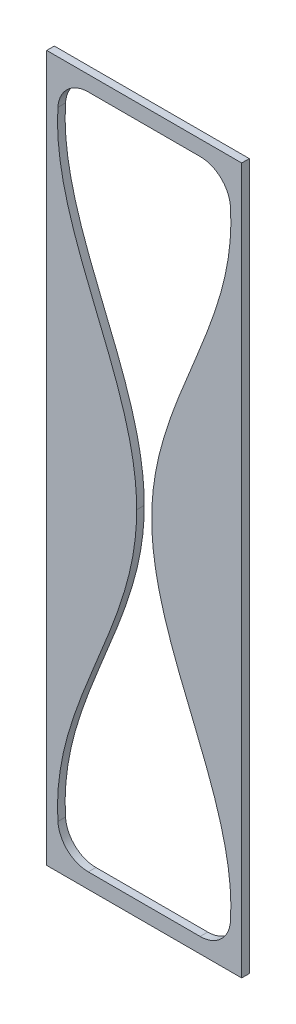
ISO-10303-21;
HEADER;
FILE_DESCRIPTION(('STEP AP214'),'2;1');
FILE_NAME('part.step','',(''),(''),'','','');
FILE_SCHEMA(('AUTOMOTIVE_DESIGN { 1 0 10303 214 1 1 1 1 }'));
ENDSEC;
DATA;
#1=APPLICATION_CONTEXT('core data for automotive mechanical design processes');
#2=APPLICATION_PROTOCOL_DEFINITION('international standard','automotive_design',2000,#1);
#3=PRODUCT_CONTEXT('',#1,'mechanical');
#4=PRODUCT('Part','Part','',(#3));
#5=PRODUCT_RELATED_PRODUCT_CATEGORY('part','',(#4));
#6=PRODUCT_DEFINITION_FORMATION('','',#4);
#7=PRODUCT_DEFINITION_CONTEXT('part definition',#1,'design');
#8=PRODUCT_DEFINITION('design','',#6,#7);
#9=PRODUCT_DEFINITION_SHAPE('','',#8);
#10=(LENGTH_UNIT() NAMED_UNIT(*) SI_UNIT(.MILLI.,.METRE.));
#11=(NAMED_UNIT(*) PLANE_ANGLE_UNIT() SI_UNIT($,.RADIAN.));
#12=(NAMED_UNIT(*) SI_UNIT($,.STERADIAN.) SOLID_ANGLE_UNIT());
#13=UNCERTAINTY_MEASURE_WITH_UNIT(LENGTH_MEASURE(1.E-05),#10,'distance_accuracy_value','');
#14=(GEOMETRIC_REPRESENTATION_CONTEXT(3) GLOBAL_UNCERTAINTY_ASSIGNED_CONTEXT((#13)) GLOBAL_UNIT_ASSIGNED_CONTEXT((#10,
#11,#12)) REPRESENTATION_CONTEXT('',''));
#15=CARTESIAN_POINT('',(0.,0.,0.));
#16=DIRECTION('',(0.,0.,1.));
#17=DIRECTION('',(1.,0.,0.));
#18=AXIS2_PLACEMENT_3D('',#15,#16,#17);
#19=CARTESIAN_POINT('',(34.35,6.35,3.175));
#20=DIRECTION('',(0.,-1.,0.));
#21=DIRECTION('',(0.,0.,-1.));
#22=AXIS2_PLACEMENT_3D('',#19,#20,#21);
#23=PLANE('',#22);
#24=DIRECTION('',(-1.,0.,0.));
#25=VECTOR('',#24,1.);
#26=CARTESIAN_POINT('',(34.35,6.35,3.175));
#27=LINE('',#26,#25);
#28=CARTESIAN_POINT('',(23.3517165061133,6.35,3.175));
#29=VERTEX_POINT('',#28);
#30=CARTESIAN_POINT('',(-23.3517165061133,6.35,3.175));
#31=VERTEX_POINT('',#30);
#32=EDGE_CURVE('E240',#29,#31,#27,.T.);
#33=ORIENTED_EDGE('',*,*,#32,.F.);
#34=DIRECTION('',(0.,0.,-1.));
#35=VECTOR('',#34,1.);
#36=CARTESIAN_POINT('',(23.3517165061133,6.35,3.175));
#37=LINE('',#36,#35);
#38=CARTESIAN_POINT('',(23.3517165061133,6.35,0.));
#39=VERTEX_POINT('',#38);
#40=EDGE_CURVE('E339',#29,#39,#37,.T.);
#41=ORIENTED_EDGE('',*,*,#40,.T.);
#42=DIRECTION('',(-1.,0.,0.));
#43=VECTOR('',#42,1.);
#44=CARTESIAN_POINT('',(34.35,6.35,0.));
#45=LINE('',#44,#43);
#46=CARTESIAN_POINT('',(-23.3517165061133,6.35,0.));
#47=VERTEX_POINT('',#46);
#48=EDGE_CURVE('E239',#39,#47,#45,.T.);
#49=ORIENTED_EDGE('',*,*,#48,.T.);
#50=DIRECTION('',(0.,0.,-1.));
#51=VECTOR('',#50,1.);
#52=CARTESIAN_POINT('',(-23.3517165061133,6.35,3.175));
#53=LINE('',#52,#51);
#54=EDGE_CURVE('E343',#47,#31,#53,.F.);
#55=ORIENTED_EDGE('',*,*,#54,.T.);
#56=EDGE_LOOP('',(#33,#41,#49,#55));
#57=FACE_BOUND('',#56,.T.);
#58=ADVANCED_FACE('F39',(#57),#23,.F.);
#59=CARTESIAN_POINT('',(0.,0.,3.175));
#60=DIRECTION('',(0.,1.,0.));
#61=DIRECTION('',(0.,0.,1.));
#62=AXIS2_PLACEMENT_3D('',#59,#60,#61);
#63=PLANE('',#62);
#64=DIRECTION('',(1.,0.,0.));
#65=VECTOR('',#64,1.);
#66=CARTESIAN_POINT('',(0.,0.,0.));
#67=LINE('',#66,#65);
#68=CARTESIAN_POINT('',(-40.7,0.,0.));
#69=VERTEX_POINT('',#68);
#70=CARTESIAN_POINT('',(40.7,0.,0.));
#71=VERTEX_POINT('',#70);
#72=EDGE_CURVE('E359',#69,#71,#67,.T.);
#73=ORIENTED_EDGE('',*,*,#72,.T.);
#74=DIRECTION('',(0.,0.,-1.));
#75=VECTOR('',#74,1.);
#76=CARTESIAN_POINT('',(40.7,0.,3.175));
#77=LINE('',#76,#75);
#78=CARTESIAN_POINT('',(40.7,0.,3.175));
#79=VERTEX_POINT('',#78);
#80=EDGE_CURVE('E257',#79,#71,#77,.T.);
#81=ORIENTED_EDGE('',*,*,#80,.F.);
#82=DIRECTION('',(1.,0.,0.));
#83=VECTOR('',#82,1.);
#84=CARTESIAN_POINT('',(0.,0.,3.175));
#85=LINE('',#84,#83);
#86=CARTESIAN_POINT('',(-40.7,0.,3.175));
#87=VERTEX_POINT('',#86);
#88=EDGE_CURVE('E244',#87,#79,#85,.T.);
#89=ORIENTED_EDGE('',*,*,#88,.F.);
#90=DIRECTION('',(0.,0.,-1.));
#91=VECTOR('',#90,1.);
#92=CARTESIAN_POINT('',(-40.7,0.,3.175));
#93=LINE('',#92,#91);
#94=EDGE_CURVE('E148',#87,#69,#93,.T.);
#95=ORIENTED_EDGE('',*,*,#94,.T.);
#96=EDGE_LOOP('',(#73,#81,#89,#95));
#97=FACE_BOUND('',#96,.T.);
#98=ADVANCED_FACE('F272',(#97),#63,.F.);
#99=CARTESIAN_POINT('',(40.7,0.,3.175));
#100=DIRECTION('',(-1.,0.,0.));
#101=DIRECTION('',(0.,0.,1.));
#102=AXIS2_PLACEMENT_3D('',#99,#100,#101);
#103=PLANE('',#102);
#104=DIRECTION('',(0.,1.,0.));
#105=VECTOR('',#104,1.);
#106=CARTESIAN_POINT('',(40.7,0.,0.));
#107=LINE('',#106,#105);
#108=CARTESIAN_POINT('',(40.7,294.64,0.));
#109=VERTEX_POINT('',#108);
#110=EDGE_CURVE('E354',#71,#109,#107,.T.);
#111=ORIENTED_EDGE('',*,*,#110,.T.);
#112=DIRECTION('',(0.,0.,-1.));
#113=VECTOR('',#112,1.);
#114=CARTESIAN_POINT('',(40.7,294.64,3.175));
#115=LINE('',#114,#113);
#116=CARTESIAN_POINT('',(40.7,294.64,3.175));
#117=VERTEX_POINT('',#116);
#118=EDGE_CURVE('E228',#117,#109,#115,.T.);
#119=ORIENTED_EDGE('',*,*,#118,.F.);
#120=DIRECTION('',(0.,1.,0.));
#121=VECTOR('',#120,1.);
#122=CARTESIAN_POINT('',(40.7,0.,3.175));
#123=LINE('',#122,#121);
#124=EDGE_CURVE('E159',#79,#117,#123,.T.);
#125=ORIENTED_EDGE('',*,*,#124,.F.);
#126=ORIENTED_EDGE('',*,*,#80,.T.);
#127=EDGE_LOOP('',(#111,#119,#125,#126));
#128=FACE_BOUND('',#127,.T.);
#129=ADVANCED_FACE('F267',(#128),#103,.F.);
#130=CARTESIAN_POINT('',(34.35,6.35,3.175));
#131=CARTESIAN_POINT('',(45.4154984844993,56.5451161534449,3.175));
#132=CARTESIAN_POINT('',(2.85240328824048,97.7876840556195,3.175));
#133=CARTESIAN_POINT('',(3.175,147.32,3.175));
#134=B_SPLINE_CURVE_WITH_KNOTS('',3,(#130,#131,#132,#133),.UNSPECIFIED.,.F.,.F.,(4,4),(0.,1.),.UNSPECIFIED.);
#135=DIRECTION('',(0.,0.,-1.));
#136=VECTOR('',#135,1.);
#137=SURFACE_OF_LINEAR_EXTRUSION('',#134,#136);
#138=CARTESIAN_POINT('',(34.35,6.35,0.));
#139=CARTESIAN_POINT('',(45.4154984844993,56.5451161534449,0.));
#140=CARTESIAN_POINT('',(2.85240328824048,97.7876840556195,0.));
#141=CARTESIAN_POINT('',(3.175,147.32,0.));
#142=B_SPLINE_CURVE_WITH_KNOTS('',3,(#138,#139,#140,#141),.UNSPECIFIED.,.F.,.F.,(4,4),(0.,1.),.UNSPECIFIED.);
#143=CARTESIAN_POINT('',(36.026342738721,18.2475974428683,0.));
#144=VERTEX_POINT('',#143);
#145=CARTESIAN_POINT('',(3.175,147.32,0.));
#146=VERTEX_POINT('',#145);
#147=EDGE_CURVE('E245',#144,#146,#142,.T.);
#148=ORIENTED_EDGE('',*,*,#147,.F.);
#149=DIRECTION('',(0.,0.,-1.));
#150=VECTOR('',#149,1.);
#151=CARTESIAN_POINT('',(36.026342738721,18.2475974428683,0.));
#152=LINE('',#151,#150);
#153=CARTESIAN_POINT('',(36.026342738721,18.2475974428683,3.175));
#154=VERTEX_POINT('',#153);
#155=EDGE_CURVE('E336',#144,#154,#152,.F.);
#156=ORIENTED_EDGE('',*,*,#155,.T.);
#157=CARTESIAN_POINT('',(3.175,147.32,3.175));
#158=VERTEX_POINT('',#157);
#159=EDGE_CURVE('E250',#154,#158,#134,.T.);
#160=ORIENTED_EDGE('',*,*,#159,.T.);
#161=DIRECTION('',(0.,0.,-1.));
#162=VECTOR('',#161,1.);
#163=CARTESIAN_POINT('',(3.175,147.32,3.175));
#164=LINE('',#163,#162);
#165=EDGE_CURVE('E190',#158,#146,#164,.T.);
#166=ORIENTED_EDGE('',*,*,#165,.T.);
#167=EDGE_LOOP('',(#148,#156,#160,#166));
#168=FACE_BOUND('',#167,.T.);
#169=ADVANCED_FACE('F263',(#168),#137,.T.);
#170=CARTESIAN_POINT('',(22.7910881647774,77.0835500783992,3.175));
#171=DIRECTION('',(0.,0.,-1.));
#172=DIRECTION('',(-1.,0.,0.));
#173=AXIS2_PLACEMENT_3D('',#170,#171,#172);
#174=PLANE('',#173);
#175=ORIENTED_EDGE('',*,*,#124,.T.);
#176=DIRECTION('',(1.,0.,0.));
#177=VECTOR('',#176,1.);
#178=CARTESIAN_POINT('',(0.,294.64,3.175));
#179=LINE('',#178,#177);
#180=CARTESIAN_POINT('',(-40.7,294.64,3.175));
#181=VERTEX_POINT('',#180);
#182=EDGE_CURVE('E155',#181,#117,#179,.T.);
#183=ORIENTED_EDGE('',*,*,#182,.F.);
#184=DIRECTION('',(0.,1.,0.));
#185=VECTOR('',#184,1.);
#186=CARTESIAN_POINT('',(-40.7,0.,3.175));
#187=LINE('',#186,#185);
#188=EDGE_CURVE('E140',#87,#181,#187,.T.);
#189=ORIENTED_EDGE('',*,*,#188,.F.);
#190=ORIENTED_EDGE('',*,*,#88,.T.);
#191=EDGE_LOOP('',(#175,#183,#189,#190));
#192=FACE_BOUND('',#191,.T.);
#193=ORIENTED_EDGE('',*,*,#159,.F.);
#194=CARTESIAN_POINT('',(23.3517165061133,19.05,3.175));
#195=DIRECTION('',(0.,0.,-1.));
#196=DIRECTION('',(-1.,0.,0.));
#197=AXIS2_PLACEMENT_3D('',#194,#195,#196);
#198=CIRCLE('',#197,12.7);
#199=EDGE_CURVE('E316',#154,#29,#198,.T.);
#200=ORIENTED_EDGE('',*,*,#199,.T.);
#201=ORIENTED_EDGE('',*,*,#32,.T.);
#202=CARTESIAN_POINT('',(-23.3517165061133,19.05,3.175));
#203=DIRECTION('',(0.,0.,-1.));
#204=DIRECTION('',(-1.,0.,0.));
#205=AXIS2_PLACEMENT_3D('',#202,#203,#204);
#206=CIRCLE('',#205,12.7);
#207=CARTESIAN_POINT('',(-36.026342738721,18.2475974428683,3.175));
#208=VERTEX_POINT('',#207);
#209=EDGE_CURVE('E308',#31,#208,#206,.T.);
#210=ORIENTED_EDGE('',*,*,#209,.T.);
#211=CARTESIAN_POINT('',(-34.35,6.35,3.175));
#212=CARTESIAN_POINT('',(-45.4154984844993,56.5451161534449,3.175));
#213=CARTESIAN_POINT('',(-2.85240328824048,97.7876840556195,3.175));
#214=CARTESIAN_POINT('',(-3.175,147.32,3.175));
#215=B_SPLINE_CURVE_WITH_KNOTS('',3,(#211,#212,#213,#214),.UNSPECIFIED.,.F.,.F.,(4,4),(0.,1.),.UNSPECIFIED.);
#216=CARTESIAN_POINT('',(-3.175,147.32,3.175));
#217=VERTEX_POINT('',#216);
#218=EDGE_CURVE('E151',#208,#217,#215,.T.);
#219=ORIENTED_EDGE('',*,*,#218,.T.);
#220=CARTESIAN_POINT('',(-34.35,288.29,3.175));
#221=CARTESIAN_POINT('',(-45.4154984844993,238.094883846555,3.175));
#222=CARTESIAN_POINT('',(-2.85240328824048,196.85231594438,3.175));
#223=CARTESIAN_POINT('',(-3.175,147.32,3.175));
#224=B_SPLINE_CURVE_WITH_KNOTS('',3,(#220,#221,#222,#223),.UNSPECIFIED.,.F.,.F.,(4,4),(0.,1.),.UNSPECIFIED.);
#225=CARTESIAN_POINT('',(-36.026342738721,276.392402557132,3.175));
#226=VERTEX_POINT('',#225);
#227=EDGE_CURVE('E178',#226,#217,#224,.T.);
#228=ORIENTED_EDGE('',*,*,#227,.F.);
#229=CARTESIAN_POINT('',(-23.3517165061133,275.59,3.175));
#230=DIRECTION('',(0.,0.,-1.));
#231=DIRECTION('',(-1.,0.,0.));
#232=AXIS2_PLACEMENT_3D('',#229,#230,#231);
#233=CIRCLE('',#232,12.7);
#234=CARTESIAN_POINT('',(-23.3517165061133,288.29,3.175));
#235=VERTEX_POINT('',#234);
#236=EDGE_CURVE('E11',#226,#235,#233,.T.);
#237=ORIENTED_EDGE('',*,*,#236,.T.);
#238=DIRECTION('',(-1.,0.,0.));
#239=VECTOR('',#238,1.);
#240=CARTESIAN_POINT('',(34.35,288.29,3.175));
#241=LINE('',#240,#239);
#242=CARTESIAN_POINT('',(23.3517165061133,288.29,3.175));
#243=VERTEX_POINT('',#242);
#244=EDGE_CURVE('E165',#243,#235,#241,.T.);
#245=ORIENTED_EDGE('',*,*,#244,.F.);
#246=CARTESIAN_POINT('',(23.3517165061133,275.59,3.175));
#247=DIRECTION('',(0.,0.,-1.));
#248=DIRECTION('',(-1.,0.,0.));
#249=AXIS2_PLACEMENT_3D('',#246,#247,#248);
#250=CIRCLE('',#249,12.7);
#251=CARTESIAN_POINT('',(36.026342738721,276.392402557132,3.175));
#252=VERTEX_POINT('',#251);
#253=EDGE_CURVE('E297',#243,#252,#250,.T.);
#254=ORIENTED_EDGE('',*,*,#253,.T.);
#255=CARTESIAN_POINT('',(34.35,288.29,3.175));
#256=CARTESIAN_POINT('',(45.4154984844993,238.094883846555,3.175));
#257=CARTESIAN_POINT('',(2.85240328824048,196.85231594438,3.175));
#258=CARTESIAN_POINT('',(3.175,147.32,3.175));
#259=B_SPLINE_CURVE_WITH_KNOTS('',3,(#255,#256,#257,#258),.UNSPECIFIED.,.F.,.F.,(4,4),(0.,1.),.UNSPECIFIED.);
#260=EDGE_CURVE('E164',#252,#158,#259,.T.);
#261=ORIENTED_EDGE('',*,*,#260,.T.);
#262=EDGE_LOOP('',(#193,#200,#201,#210,#219,#228,#237,#245,#254,#261));
#263=FACE_BOUND('',#262,.T.);
#264=ADVANCED_FACE('F156',(#192,#263),#174,.F.);
#265=CARTESIAN_POINT('',(22.7910881647774,77.0835500783992,0.));
#266=DIRECTION('',(0.,0.,-1.));
#267=DIRECTION('',(-1.,0.,0.));
#268=AXIS2_PLACEMENT_3D('',#265,#266,#267);
#269=PLANE('',#268);
#270=DIRECTION('',(1.,0.,0.));
#271=VECTOR('',#270,1.);
#272=CARTESIAN_POINT('',(0.,294.64,0.));
#273=LINE('',#272,#271);
#274=CARTESIAN_POINT('',(-40.7,294.64,0.));
#275=VERTEX_POINT('',#274);
#276=EDGE_CURVE('E169',#275,#109,#273,.T.);
#277=ORIENTED_EDGE('',*,*,#276,.T.);
#278=ORIENTED_EDGE('',*,*,#110,.F.);
#279=ORIENTED_EDGE('',*,*,#72,.F.);
#280=DIRECTION('',(0.,1.,0.));
#281=VECTOR('',#280,1.);
#282=CARTESIAN_POINT('',(-40.7,0.,0.));
#283=LINE('',#282,#281);
#284=EDGE_CURVE('E222',#69,#275,#283,.T.);
#285=ORIENTED_EDGE('',*,*,#284,.T.);
#286=EDGE_LOOP('',(#277,#278,#279,#285));
#287=FACE_BOUND('',#286,.T.);
#288=ORIENTED_EDGE('',*,*,#48,.F.);
#289=CARTESIAN_POINT('',(23.3517165061133,19.05,0.));
#290=DIRECTION('',(0.,0.,-1.));
#291=DIRECTION('',(-1.,0.,0.));
#292=AXIS2_PLACEMENT_3D('',#289,#290,#291);
#293=CIRCLE('',#292,12.7);
#294=EDGE_CURVE('E319',#39,#144,#293,.F.);
#295=ORIENTED_EDGE('',*,*,#294,.T.);
#296=ORIENTED_EDGE('',*,*,#147,.T.);
#297=CARTESIAN_POINT('',(34.35,288.29,0.));
#298=CARTESIAN_POINT('',(45.4154984844993,238.094883846555,0.));
#299=CARTESIAN_POINT('',(2.85240328824048,196.85231594438,0.));
#300=CARTESIAN_POINT('',(3.175,147.32,0.));
#301=B_SPLINE_CURVE_WITH_KNOTS('',3,(#297,#298,#299,#300),.UNSPECIFIED.,.F.,.F.,(4,4),(0.,1.),.UNSPECIFIED.);
#302=CARTESIAN_POINT('',(36.026342738721,276.392402557132,0.));
#303=VERTEX_POINT('',#302);
#304=EDGE_CURVE('E184',#303,#146,#301,.T.);
#305=ORIENTED_EDGE('',*,*,#304,.F.);
#306=CARTESIAN_POINT('',(23.3517165061133,275.59,0.));
#307=DIRECTION('',(0.,0.,-1.));
#308=DIRECTION('',(-1.,0.,0.));
#309=AXIS2_PLACEMENT_3D('',#306,#307,#308);
#310=CIRCLE('',#309,12.7);
#311=CARTESIAN_POINT('',(23.3517165061133,288.29,0.));
#312=VERTEX_POINT('',#311);
#313=EDGE_CURVE('E304',#303,#312,#310,.F.);
#314=ORIENTED_EDGE('',*,*,#313,.T.);
#315=DIRECTION('',(-1.,0.,0.));
#316=VECTOR('',#315,1.);
#317=CARTESIAN_POINT('',(34.35,288.29,0.));
#318=LINE('',#317,#316);
#319=CARTESIAN_POINT('',(-23.3517165061133,288.29,0.));
#320=VERTEX_POINT('',#319);
#321=EDGE_CURVE('E171',#312,#320,#318,.T.);
#322=ORIENTED_EDGE('',*,*,#321,.T.);
#323=CARTESIAN_POINT('',(-23.3517165061133,275.59,0.));
#324=DIRECTION('',(0.,0.,-1.));
#325=DIRECTION('',(-1.,0.,0.));
#326=AXIS2_PLACEMENT_3D('',#323,#324,#325);
#327=CIRCLE('',#326,12.7);
#328=CARTESIAN_POINT('',(-36.026342738721,276.392402557132,0.));
#329=VERTEX_POINT('',#328);
#330=EDGE_CURVE('E48',#320,#329,#327,.F.);
#331=ORIENTED_EDGE('',*,*,#330,.T.);
#332=CARTESIAN_POINT('',(-34.35,288.29,0.));
#333=CARTESIAN_POINT('',(-45.4154984844993,238.094883846555,0.));
#334=CARTESIAN_POINT('',(-2.85240328824048,196.85231594438,0.));
#335=CARTESIAN_POINT('',(-3.175,147.32,0.));
#336=B_SPLINE_CURVE_WITH_KNOTS('',3,(#332,#333,#334,#335),.UNSPECIFIED.,.F.,.F.,(4,4),(0.,1.),.UNSPECIFIED.);
#337=CARTESIAN_POINT('',(-3.175,147.32,0.));
#338=VERTEX_POINT('',#337);
#339=EDGE_CURVE('E374',#329,#338,#336,.T.);
#340=ORIENTED_EDGE('',*,*,#339,.T.);
#341=CARTESIAN_POINT('',(-34.35,6.35,0.));
#342=CARTESIAN_POINT('',(-45.4154984844993,56.5451161534449,0.));
#343=CARTESIAN_POINT('',(-2.85240328824048,97.7876840556195,0.));
#344=CARTESIAN_POINT('',(-3.175,147.32,0.));
#345=B_SPLINE_CURVE_WITH_KNOTS('',3,(#341,#342,#343,#344),.UNSPECIFIED.,.F.,.F.,(4,4),(0.,1.),.UNSPECIFIED.);
#346=CARTESIAN_POINT('',(-36.026342738721,18.2475974428683,0.));
#347=VERTEX_POINT('',#346);
#348=EDGE_CURVE('E152',#347,#338,#345,.T.);
#349=ORIENTED_EDGE('',*,*,#348,.F.);
#350=CARTESIAN_POINT('',(-23.3517165061133,19.05,0.));
#351=DIRECTION('',(0.,0.,-1.));
#352=DIRECTION('',(-1.,0.,0.));
#353=AXIS2_PLACEMENT_3D('',#350,#351,#352);
#354=CIRCLE('',#353,12.7);
#355=EDGE_CURVE('E313',#347,#47,#354,.F.);
#356=ORIENTED_EDGE('',*,*,#355,.T.);
#357=EDGE_LOOP('',(#288,#295,#296,#305,#314,#322,#331,#340,#349,#356));
#358=FACE_BOUND('',#357,.T.);
#359=ADVANCED_FACE('F269',(#287,#358),#269,.T.);
#360=CARTESIAN_POINT('',(-40.7,0.,3.175));
#361=DIRECTION('',(1.,0.,0.));
#362=DIRECTION('',(0.,0.,1.));
#363=AXIS2_PLACEMENT_3D('',#360,#361,#362);
#364=PLANE('',#363);
#365=ORIENTED_EDGE('',*,*,#284,.F.);
#366=ORIENTED_EDGE('',*,*,#94,.F.);
#367=ORIENTED_EDGE('',*,*,#188,.T.);
#368=DIRECTION('',(0.,0.,-1.));
#369=VECTOR('',#368,1.);
#370=CARTESIAN_POINT('',(-40.7,294.64,3.175));
#371=LINE('',#370,#369);
#372=EDGE_CURVE('E145',#181,#275,#371,.T.);
#373=ORIENTED_EDGE('',*,*,#372,.T.);
#374=EDGE_LOOP('',(#365,#366,#367,#373));
#375=FACE_BOUND('',#374,.T.);
#376=ADVANCED_FACE('F143',(#375),#364,.F.);
#377=DIRECTION('',(0.,0.,-1.));
#378=VECTOR('',#377,1.);
#379=SURFACE_OF_LINEAR_EXTRUSION('',#215,#378);
#380=ORIENTED_EDGE('',*,*,#218,.F.);
#381=DIRECTION('',(0.,0.,-1.));
#382=VECTOR('',#381,1.);
#383=CARTESIAN_POINT('',(-36.026342738721,18.2475974428683,3.175));
#384=LINE('',#383,#382);
#385=EDGE_CURVE('E332',#208,#347,#384,.T.);
#386=ORIENTED_EDGE('',*,*,#385,.T.);
#387=ORIENTED_EDGE('',*,*,#348,.T.);
#388=DIRECTION('',(0.,0.,-1.));
#389=VECTOR('',#388,1.);
#390=CARTESIAN_POINT('',(-3.175,147.32,3.175));
#391=LINE('',#390,#389);
#392=EDGE_CURVE('E172',#217,#338,#391,.T.);
#393=ORIENTED_EDGE('',*,*,#392,.F.);
#394=EDGE_LOOP('',(#380,#386,#387,#393));
#395=FACE_BOUND('',#394,.T.);
#396=ADVANCED_FACE('F208',(#395),#379,.F.);
#397=CARTESIAN_POINT('',(34.35,288.29,3.175));
#398=DIRECTION('',(0.,1.,0.));
#399=DIRECTION('',(0.,0.,-1.));
#400=AXIS2_PLACEMENT_3D('',#397,#398,#399);
#401=PLANE('',#400);
#402=ORIENTED_EDGE('',*,*,#321,.F.);
#403=DIRECTION('',(0.,0.,-1.));
#404=VECTOR('',#403,1.);
#405=CARTESIAN_POINT('',(23.3517165061133,288.29,3.175));
#406=LINE('',#405,#404);
#407=EDGE_CURVE('E298',#312,#243,#406,.F.);
#408=ORIENTED_EDGE('',*,*,#407,.T.);
#409=ORIENTED_EDGE('',*,*,#244,.T.);
#410=DIRECTION('',(0.,0.,-1.));
#411=VECTOR('',#410,1.);
#412=CARTESIAN_POINT('',(-23.3517165061133,288.29,3.175));
#413=LINE('',#412,#411);
#414=EDGE_CURVE('E326',#235,#320,#413,.T.);
#415=ORIENTED_EDGE('',*,*,#414,.T.);
#416=EDGE_LOOP('',(#402,#408,#409,#415));
#417=FACE_BOUND('',#416,.T.);
#418=ADVANCED_FACE('F205',(#417),#401,.F.);
#419=CARTESIAN_POINT('',(0.,294.64,3.175));
#420=DIRECTION('',(0.,-1.,0.));
#421=DIRECTION('',(0.,0.,1.));
#422=AXIS2_PLACEMENT_3D('',#419,#420,#421);
#423=PLANE('',#422);
#424=ORIENTED_EDGE('',*,*,#276,.F.);
#425=ORIENTED_EDGE('',*,*,#372,.F.);
#426=ORIENTED_EDGE('',*,*,#182,.T.);
#427=ORIENTED_EDGE('',*,*,#118,.T.);
#428=EDGE_LOOP('',(#424,#425,#426,#427));
#429=FACE_BOUND('',#428,.T.);
#430=ADVANCED_FACE('F167',(#429),#423,.F.);
#431=DIRECTION('',(0.,0.,-1.));
#432=VECTOR('',#431,1.);
#433=SURFACE_OF_LINEAR_EXTRUSION('',#259,#432);
#434=ORIENTED_EDGE('',*,*,#260,.F.);
#435=DIRECTION('',(0.,0.,-1.));
#436=VECTOR('',#435,1.);
#437=CARTESIAN_POINT('',(36.026342738721,276.392402557132,3.175));
#438=LINE('',#437,#436);
#439=EDGE_CURVE('E300',#252,#303,#438,.T.);
#440=ORIENTED_EDGE('',*,*,#439,.T.);
#441=ORIENTED_EDGE('',*,*,#304,.T.);
#442=ORIENTED_EDGE('',*,*,#165,.F.);
#443=EDGE_LOOP('',(#434,#440,#441,#442));
#444=FACE_BOUND('',#443,.T.);
#445=ADVANCED_FACE('F196',(#444),#433,.F.);
#446=DIRECTION('',(0.,0.,-1.));
#447=VECTOR('',#446,1.);
#448=SURFACE_OF_LINEAR_EXTRUSION('',#224,#447);
#449=ORIENTED_EDGE('',*,*,#339,.F.);
#450=DIRECTION('',(0.,0.,-1.));
#451=VECTOR('',#450,1.);
#452=CARTESIAN_POINT('',(-36.026342738721,276.392402557132,0.));
#453=LINE('',#452,#451);
#454=EDGE_CURVE('E55',#329,#226,#453,.F.);
#455=ORIENTED_EDGE('',*,*,#454,.T.);
#456=ORIENTED_EDGE('',*,*,#227,.T.);
#457=ORIENTED_EDGE('',*,*,#392,.T.);
#458=EDGE_LOOP('',(#449,#455,#456,#457));
#459=FACE_BOUND('',#458,.T.);
#460=ADVANCED_FACE('F200',(#459),#448,.T.);
#461=CARTESIAN_POINT('',(23.3517165061133,19.05,1.5875));
#462=DIRECTION('',(0.,0.,-1.));
#463=DIRECTION('',(-1.,0.,0.));
#464=AXIS2_PLACEMENT_3D('',#461,#462,#463);
#465=CYLINDRICAL_SURFACE('',#464,12.7);
#466=ORIENTED_EDGE('',*,*,#199,.F.);
#467=ORIENTED_EDGE('',*,*,#155,.F.);
#468=ORIENTED_EDGE('',*,*,#294,.F.);
#469=ORIENTED_EDGE('',*,*,#40,.F.);
#470=EDGE_LOOP('',(#466,#467,#468,#469));
#471=FACE_BOUND('',#470,.T.);
#472=ADVANCED_FACE('F280',(#471),#465,.F.);
#473=CARTESIAN_POINT('',(-23.3517165061133,19.05,1.5875));
#474=DIRECTION('',(0.,0.,-1.));
#475=DIRECTION('',(-1.,0.,0.));
#476=AXIS2_PLACEMENT_3D('',#473,#474,#475);
#477=CYLINDRICAL_SURFACE('',#476,12.7);
#478=ORIENTED_EDGE('',*,*,#209,.F.);
#479=ORIENTED_EDGE('',*,*,#54,.F.);
#480=ORIENTED_EDGE('',*,*,#355,.F.);
#481=ORIENTED_EDGE('',*,*,#385,.F.);
#482=EDGE_LOOP('',(#478,#479,#480,#481));
#483=FACE_BOUND('',#482,.T.);
#484=ADVANCED_FACE('F283',(#483),#477,.F.);
#485=CARTESIAN_POINT('',(23.3517165061133,275.59,1.5875));
#486=DIRECTION('',(0.,0.,-1.));
#487=DIRECTION('',(-1.,0.,0.));
#488=AXIS2_PLACEMENT_3D('',#485,#486,#487);
#489=CYLINDRICAL_SURFACE('',#488,12.7);
#490=ORIENTED_EDGE('',*,*,#253,.F.);
#491=ORIENTED_EDGE('',*,*,#407,.F.);
#492=ORIENTED_EDGE('',*,*,#313,.F.);
#493=ORIENTED_EDGE('',*,*,#439,.F.);
#494=EDGE_LOOP('',(#490,#491,#492,#493));
#495=FACE_BOUND('',#494,.T.);
#496=ADVANCED_FACE('F286',(#495),#489,.F.);
#497=CARTESIAN_POINT('',(-23.3517165061133,275.59,1.5875));
#498=DIRECTION('',(0.,0.,-1.));
#499=DIRECTION('',(-1.,0.,0.));
#500=AXIS2_PLACEMENT_3D('',#497,#498,#499);
#501=CYLINDRICAL_SURFACE('',#500,12.7);
#502=ORIENTED_EDGE('',*,*,#236,.F.);
#503=ORIENTED_EDGE('',*,*,#454,.F.);
#504=ORIENTED_EDGE('',*,*,#330,.F.);
#505=ORIENTED_EDGE('',*,*,#414,.F.);
#506=EDGE_LOOP('',(#502,#503,#504,#505));
#507=FACE_BOUND('',#506,.T.);
#508=ADVANCED_FACE('F41',(#507),#501,.F.);
#509=CLOSED_SHELL('',(#58,#98,#129,#169,#264,#359,#376,#396,#418,#430,#445,#460,#472,#484,#496,#508));
#510=MANIFOLD_SOLID_BREP('B2',#509);
#511=ADVANCED_BREP_SHAPE_REPRESENTATION('',(#18,#510),#14);
#512=SHAPE_DEFINITION_REPRESENTATION(#9,#511);
ENDSEC;
END-ISO-10303-21;
